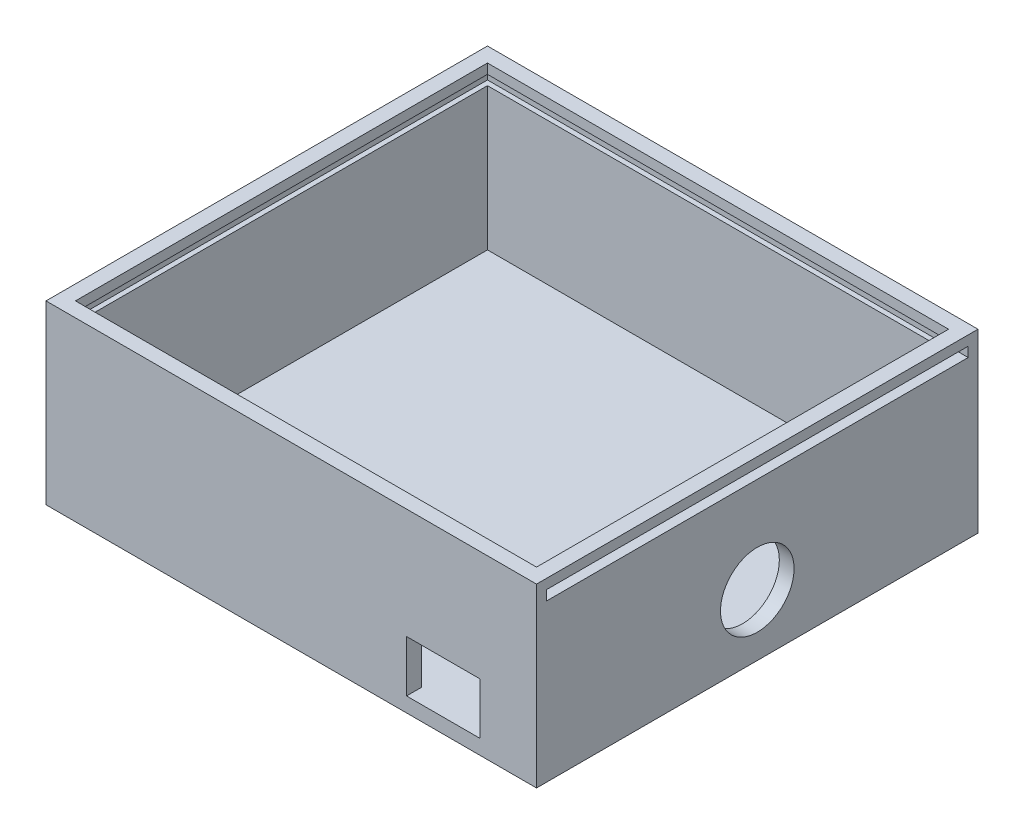
ISO-10303-21;
HEADER;
FILE_DESCRIPTION(('STEP AP214'),'2;1');
FILE_NAME('part.step','',(''),(''),'','','');
FILE_SCHEMA(('AUTOMOTIVE_DESIGN { 1 0 10303 214 1 1 1 1 }'));
ENDSEC;
DATA;
#1=APPLICATION_CONTEXT('core data for automotive mechanical design processes');
#2=APPLICATION_PROTOCOL_DEFINITION('international standard','automotive_design',2000,#1);
#3=PRODUCT_CONTEXT('',#1,'mechanical');
#4=PRODUCT('Part','Part','',(#3));
#5=PRODUCT_RELATED_PRODUCT_CATEGORY('part','',(#4));
#6=PRODUCT_DEFINITION_FORMATION('','',#4);
#7=PRODUCT_DEFINITION_CONTEXT('part definition',#1,'design');
#8=PRODUCT_DEFINITION('design','',#6,#7);
#9=PRODUCT_DEFINITION_SHAPE('','',#8);
#10=(LENGTH_UNIT() NAMED_UNIT(*) SI_UNIT(.MILLI.,.METRE.));
#11=(NAMED_UNIT(*) PLANE_ANGLE_UNIT() SI_UNIT($,.RADIAN.));
#12=(NAMED_UNIT(*) SI_UNIT($,.STERADIAN.) SOLID_ANGLE_UNIT());
#13=UNCERTAINTY_MEASURE_WITH_UNIT(LENGTH_MEASURE(1.E-05),#10,'distance_accuracy_value','');
#14=(GEOMETRIC_REPRESENTATION_CONTEXT(3) GLOBAL_UNCERTAINTY_ASSIGNED_CONTEXT((#13)) GLOBAL_UNIT_ASSIGNED_CONTEXT((#10,
#11,#12)) REPRESENTATION_CONTEXT('',''));
#15=CARTESIAN_POINT('',(0.,0.,0.));
#16=DIRECTION('',(0.,0.,1.));
#17=DIRECTION('',(1.,0.,0.));
#18=AXIS2_PLACEMENT_3D('',#15,#16,#17);
#19=CARTESIAN_POINT('',(3.,0.,90.));
#20=DIRECTION('',(1.,0.,0.));
#21=DIRECTION('',(0.,1.,0.));
#22=AXIS2_PLACEMENT_3D('',#19,#20,#21);
#23=PLANE('',#22);
#24=DIRECTION('',(0.,0.,1.));
#25=VECTOR('',#24,1.);
#26=CARTESIAN_POINT('',(3.,-2.00000000000002,90.));
#27=LINE('',#26,#25);
#28=CARTESIAN_POINT('',(3.,-2.00000000000002,3.));
#29=VERTEX_POINT('',#28);
#30=CARTESIAN_POINT('',(3.,-2.00000000000002,87.));
#31=VERTEX_POINT('',#30);
#32=EDGE_CURVE('E248',#29,#31,#27,.T.);
#33=ORIENTED_EDGE('',*,*,#32,.F.);
#34=DIRECTION('',(0.,-1.,0.));
#35=VECTOR('',#34,1.);
#36=CARTESIAN_POINT('',(3.,0.,3.));
#37=LINE('',#36,#35);
#38=CARTESIAN_POINT('',(3.,0.,3.));
#39=VERTEX_POINT('',#38);
#40=EDGE_CURVE('E284',#39,#29,#37,.T.);
#41=ORIENTED_EDGE('',*,*,#40,.F.);
#42=DIRECTION('',(0.,0.,-1.));
#43=VECTOR('',#42,1.);
#44=CARTESIAN_POINT('',(3.,0.,90.));
#45=LINE('',#44,#43);
#46=CARTESIAN_POINT('',(3.,0.,87.));
#47=VERTEX_POINT('',#46);
#48=EDGE_CURVE('E323',#47,#39,#45,.T.);
#49=ORIENTED_EDGE('',*,*,#48,.F.);
#50=DIRECTION('',(0.,-1.,0.));
#51=VECTOR('',#50,1.);
#52=CARTESIAN_POINT('',(3.,0.,87.));
#53=LINE('',#52,#51);
#54=EDGE_CURVE('E295',#47,#31,#53,.T.);
#55=ORIENTED_EDGE('',*,*,#54,.T.);
#56=EDGE_LOOP('',(#33,#41,#49,#55));
#57=FACE_BOUND('',#56,.T.);
#58=ADVANCED_FACE('F45',(#57),#23,.T.);
#59=CARTESIAN_POINT('',(97.,0.,90.));
#60=DIRECTION('',(-1.,0.,0.));
#61=DIRECTION('',(0.,0.,1.));
#62=AXIS2_PLACEMENT_3D('',#59,#60,#61);
#63=PLANE('',#62);
#64=DIRECTION('',(0.,0.,-1.));
#65=VECTOR('',#64,1.);
#66=CARTESIAN_POINT('',(97.,-2.00000000000002,90.));
#67=LINE('',#66,#65);
#68=CARTESIAN_POINT('',(97.,-2.00000000000002,87.));
#69=VERTEX_POINT('',#68);
#70=CARTESIAN_POINT('',(97.,-2.00000000000002,3.));
#71=VERTEX_POINT('',#70);
#72=EDGE_CURVE('E69',#69,#71,#67,.T.);
#73=ORIENTED_EDGE('',*,*,#72,.F.);
#74=DIRECTION('',(0.,1.,0.));
#75=VECTOR('',#74,1.);
#76=CARTESIAN_POINT('',(97.,0.,87.));
#77=LINE('',#76,#75);
#78=CARTESIAN_POINT('',(97.,0.,87.));
#79=VERTEX_POINT('',#78);
#80=EDGE_CURVE('E312',#69,#79,#77,.T.);
#81=ORIENTED_EDGE('',*,*,#80,.T.);
#82=DIRECTION('',(0.,0.,-1.));
#83=VECTOR('',#82,1.);
#84=CARTESIAN_POINT('',(97.,0.,90.));
#85=LINE('',#84,#83);
#86=CARTESIAN_POINT('',(97.,0.,3.));
#87=VERTEX_POINT('',#86);
#88=EDGE_CURVE('E307',#79,#87,#85,.T.);
#89=ORIENTED_EDGE('',*,*,#88,.T.);
#90=DIRECTION('',(0.,1.,0.));
#91=VECTOR('',#90,1.);
#92=CARTESIAN_POINT('',(97.,0.,3.));
#93=LINE('',#92,#91);
#94=EDGE_CURVE('E303',#71,#87,#93,.T.);
#95=ORIENTED_EDGE('',*,*,#94,.F.);
#96=EDGE_LOOP('',(#73,#81,#89,#95));
#97=FACE_BOUND('',#96,.T.);
#98=ADVANCED_FACE('F420',(#97),#63,.T.);
#99=CARTESIAN_POINT('',(0.,0.,87.));
#100=DIRECTION('',(0.,0.,1.));
#101=DIRECTION('',(1.,0.,0.));
#102=AXIS2_PLACEMENT_3D('',#99,#100,#101);
#103=PLANE('',#102);
#104=ORIENTED_EDGE('',*,*,#80,.F.);
#105=DIRECTION('',(-1.,0.,0.));
#106=VECTOR('',#105,1.);
#107=CARTESIAN_POINT('',(0.,-2.00000000000002,87.));
#108=LINE('',#107,#106);
#109=EDGE_CURVE('E251',#69,#31,#108,.T.);
#110=ORIENTED_EDGE('',*,*,#109,.T.);
#111=ORIENTED_EDGE('',*,*,#54,.F.);
#112=DIRECTION('',(-1.,0.,0.));
#113=VECTOR('',#112,1.);
#114=CARTESIAN_POINT('',(0.,0.,87.));
#115=LINE('',#114,#113);
#116=EDGE_CURVE('E322',#79,#47,#115,.T.);
#117=ORIENTED_EDGE('',*,*,#116,.F.);
#118=EDGE_LOOP('',(#104,#110,#111,#117));
#119=FACE_BOUND('',#118,.T.);
#120=ADVANCED_FACE('F426',(#119),#103,.F.);
#121=CARTESIAN_POINT('',(0.,0.,3.));
#122=DIRECTION('',(0.,0.,1.));
#123=DIRECTION('',(1.,0.,0.));
#124=AXIS2_PLACEMENT_3D('',#121,#122,#123);
#125=PLANE('',#124);
#126=DIRECTION('',(-1.,0.,0.));
#127=VECTOR('',#126,1.);
#128=CARTESIAN_POINT('',(0.,-2.00000000000002,3.));
#129=LINE('',#128,#127);
#130=EDGE_CURVE('E11',#71,#29,#129,.T.);
#131=ORIENTED_EDGE('',*,*,#130,.F.);
#132=ORIENTED_EDGE('',*,*,#94,.T.);
#133=DIRECTION('',(-1.,0.,0.));
#134=VECTOR('',#133,1.);
#135=CARTESIAN_POINT('',(0.,0.,3.));
#136=LINE('',#135,#134);
#137=EDGE_CURVE('E317',#87,#39,#136,.T.);
#138=ORIENTED_EDGE('',*,*,#137,.T.);
#139=ORIENTED_EDGE('',*,*,#40,.T.);
#140=EDGE_LOOP('',(#131,#132,#138,#139));
#141=FACE_BOUND('',#140,.T.);
#142=ADVANCED_FACE('F431',(#141),#125,.T.);
#143=CARTESIAN_POINT('',(0.,0.,90.));
#144=DIRECTION('',(0.,-1.,0.));
#145=DIRECTION('',(0.,0.,-1.));
#146=AXIS2_PLACEMENT_3D('',#143,#144,#145);
#147=PLANE('',#146);
#148=DIRECTION('',(-1.,0.,0.));
#149=VECTOR('',#148,1.);
#150=CARTESIAN_POINT('',(0.,0.,0.));
#151=LINE('',#150,#149);
#152=CARTESIAN_POINT('',(100.,0.,0.));
#153=VERTEX_POINT('',#152);
#154=CARTESIAN_POINT('',(0.,0.,0.));
#155=VERTEX_POINT('',#154);
#156=EDGE_CURVE('E340',#153,#155,#151,.T.);
#157=ORIENTED_EDGE('',*,*,#156,.T.);
#158=DIRECTION('',(0.,0.,-1.));
#159=VECTOR('',#158,1.);
#160=CARTESIAN_POINT('',(0.,0.,90.));
#161=LINE('',#160,#159);
#162=CARTESIAN_POINT('',(0.,0.,90.));
#163=VERTEX_POINT('',#162);
#164=EDGE_CURVE('E349',#163,#155,#161,.T.);
#165=ORIENTED_EDGE('',*,*,#164,.F.);
#166=DIRECTION('',(-1.,0.,0.));
#167=VECTOR('',#166,1.);
#168=CARTESIAN_POINT('',(0.,0.,90.));
#169=LINE('',#168,#167);
#170=CARTESIAN_POINT('',(100.,0.,90.));
#171=VERTEX_POINT('',#170);
#172=EDGE_CURVE('E346',#171,#163,#169,.T.);
#173=ORIENTED_EDGE('',*,*,#172,.F.);
#174=DIRECTION('',(0.,0.,-1.));
#175=VECTOR('',#174,1.);
#176=CARTESIAN_POINT('',(100.,0.,90.));
#177=LINE('',#176,#175);
#178=EDGE_CURVE('E364',#171,#153,#177,.T.);
#179=ORIENTED_EDGE('',*,*,#178,.T.);
#180=EDGE_LOOP('',(#157,#165,#173,#179));
#181=FACE_BOUND('',#180,.T.);
#182=ORIENTED_EDGE('',*,*,#137,.F.);
#183=ORIENTED_EDGE('',*,*,#88,.F.);
#184=ORIENTED_EDGE('',*,*,#116,.T.);
#185=ORIENTED_EDGE('',*,*,#48,.T.);
#186=EDGE_LOOP('',(#182,#183,#184,#185));
#187=FACE_BOUND('',#186,.T.);
#188=ADVANCED_FACE('F428',(#181,#187),#147,.F.);
#189=CARTESIAN_POINT('',(0.,0.,90.));
#190=DIRECTION('',(1.,0.,0.));
#191=DIRECTION('',(0.,1.,0.));
#192=AXIS2_PLACEMENT_3D('',#189,#190,#191);
#193=PLANE('',#192);
#194=DIRECTION('',(0.,-1.,0.));
#195=VECTOR('',#194,1.);
#196=CARTESIAN_POINT('',(0.,0.,0.));
#197=LINE('',#196,#195);
#198=CARTESIAN_POINT('',(0.,-36.,0.));
#199=VERTEX_POINT('',#198);
#200=EDGE_CURVE('E293',#155,#199,#197,.T.);
#201=ORIENTED_EDGE('',*,*,#200,.T.);
#202=DIRECTION('',(0.,0.,-1.));
#203=VECTOR('',#202,1.);
#204=CARTESIAN_POINT('',(0.,-36.,90.));
#205=LINE('',#204,#203);
#206=CARTESIAN_POINT('',(0.,-36.,90.));
#207=VERTEX_POINT('',#206);
#208=EDGE_CURVE('E372',#207,#199,#205,.T.);
#209=ORIENTED_EDGE('',*,*,#208,.F.);
#210=DIRECTION('',(0.,-1.,0.));
#211=VECTOR('',#210,1.);
#212=CARTESIAN_POINT('',(0.,0.,90.));
#213=LINE('',#212,#211);
#214=EDGE_CURVE('E335',#163,#207,#213,.T.);
#215=ORIENTED_EDGE('',*,*,#214,.F.);
#216=ORIENTED_EDGE('',*,*,#164,.T.);
#217=EDGE_LOOP('',(#201,#209,#215,#216));
#218=FACE_BOUND('',#217,.T.);
#219=ADVANCED_FACE('F47',(#218),#193,.F.);
#220=CARTESIAN_POINT('',(0.,-36.,90.));
#221=DIRECTION('',(0.,1.,0.));
#222=DIRECTION('',(0.,0.,1.));
#223=AXIS2_PLACEMENT_3D('',#220,#221,#222);
#224=PLANE('',#223);
#225=DIRECTION('',(1.,0.,0.));
#226=VECTOR('',#225,1.);
#227=CARTESIAN_POINT('',(0.,-36.,0.));
#228=LINE('',#227,#226);
#229=CARTESIAN_POINT('',(100.,-36.,0.));
#230=VERTEX_POINT('',#229);
#231=EDGE_CURVE('E353',#199,#230,#228,.T.);
#232=ORIENTED_EDGE('',*,*,#231,.T.);
#233=DIRECTION('',(0.,0.,-1.));
#234=VECTOR('',#233,1.);
#235=CARTESIAN_POINT('',(100.,-36.,90.));
#236=LINE('',#235,#234);
#237=CARTESIAN_POINT('',(100.,-36.,90.));
#238=VERTEX_POINT('',#237);
#239=EDGE_CURVE('E368',#238,#230,#236,.T.);
#240=ORIENTED_EDGE('',*,*,#239,.F.);
#241=DIRECTION('',(1.,0.,0.));
#242=VECTOR('',#241,1.);
#243=CARTESIAN_POINT('',(0.,-36.,90.));
#244=LINE('',#243,#242);
#245=EDGE_CURVE('E339',#207,#238,#244,.T.);
#246=ORIENTED_EDGE('',*,*,#245,.F.);
#247=ORIENTED_EDGE('',*,*,#208,.T.);
#248=EDGE_LOOP('',(#232,#240,#246,#247));
#249=FACE_BOUND('',#248,.T.);
#250=ADVANCED_FACE('F483',(#249),#224,.F.);
#251=CARTESIAN_POINT('',(100.,0.,90.));
#252=DIRECTION('',(-1.,0.,0.));
#253=DIRECTION('',(0.,0.,1.));
#254=AXIS2_PLACEMENT_3D('',#251,#252,#253);
#255=PLANE('',#254);
#256=CARTESIAN_POINT('',(100.,-23.5,45.));
#257=DIRECTION('',(1.,0.,0.));
#258=DIRECTION('',(0.,0.,-1.));
#259=AXIS2_PLACEMENT_3D('',#256,#257,#258);
#260=CIRCLE('',#259,7.5);
#261=CARTESIAN_POINT('',(100.,-23.5,37.5));
#262=VERTEX_POINT('',#261);
#263=EDGE_CURVE('E214',#262,#262,#260,.T.);
#264=ORIENTED_EDGE('',*,*,#263,.F.);
#265=EDGE_LOOP('',(#264));
#266=FACE_BOUND('',#265,.T.);
#267=DIRECTION('',(0.,0.,-1.));
#268=VECTOR('',#267,1.);
#269=CARTESIAN_POINT('',(100.,-4.00000000000002,88.));
#270=LINE('',#269,#268);
#271=CARTESIAN_POINT('',(100.,-4.00000000000002,88.));
#272=VERTEX_POINT('',#271);
#273=CARTESIAN_POINT('',(100.,-4.,2.));
#274=VERTEX_POINT('',#273);
#275=EDGE_CURVE('E222',#272,#274,#270,.T.);
#276=ORIENTED_EDGE('',*,*,#275,.F.);
#277=DIRECTION('',(0.,-1.,0.));
#278=VECTOR('',#277,1.);
#279=CARTESIAN_POINT('',(100.,-2.00000000000002,88.));
#280=LINE('',#279,#278);
#281=CARTESIAN_POINT('',(100.,-2.00000000000002,88.));
#282=VERTEX_POINT('',#281);
#283=EDGE_CURVE('E62',#282,#272,#280,.T.);
#284=ORIENTED_EDGE('',*,*,#283,.F.);
#285=DIRECTION('',(0.,0.,1.));
#286=VECTOR('',#285,1.);
#287=CARTESIAN_POINT('',(100.,-2.00000000000002,88.));
#288=LINE('',#287,#286);
#289=CARTESIAN_POINT('',(100.,-2.00000000000002,2.));
#290=VERTEX_POINT('',#289);
#291=EDGE_CURVE('E207',#290,#282,#288,.T.);
#292=ORIENTED_EDGE('',*,*,#291,.F.);
#293=DIRECTION('',(0.,1.,0.));
#294=VECTOR('',#293,1.);
#295=CARTESIAN_POINT('',(100.,-2.00000000000002,2.));
#296=LINE('',#295,#294);
#297=EDGE_CURVE('E211',#274,#290,#296,.T.);
#298=ORIENTED_EDGE('',*,*,#297,.F.);
#299=EDGE_LOOP('',(#276,#284,#292,#298));
#300=FACE_BOUND('',#299,.T.);
#301=DIRECTION('',(0.,1.,0.));
#302=VECTOR('',#301,1.);
#303=CARTESIAN_POINT('',(100.,0.,0.));
#304=LINE('',#303,#302);
#305=EDGE_CURVE('E356',#230,#153,#304,.T.);
#306=ORIENTED_EDGE('',*,*,#305,.T.);
#307=ORIENTED_EDGE('',*,*,#178,.F.);
#308=DIRECTION('',(0.,1.,0.));
#309=VECTOR('',#308,1.);
#310=CARTESIAN_POINT('',(100.,0.,90.));
#311=LINE('',#310,#309);
#312=EDGE_CURVE('E343',#238,#171,#311,.T.);
#313=ORIENTED_EDGE('',*,*,#312,.F.);
#314=ORIENTED_EDGE('',*,*,#239,.T.);
#315=EDGE_LOOP('',(#306,#307,#313,#314));
#316=FACE_BOUND('',#315,.T.);
#317=ADVANCED_FACE('F474',(#266,#300,#316),#255,.F.);
#318=CARTESIAN_POINT('',(0.,0.,90.));
#319=DIRECTION('',(0.,0.,1.));
#320=DIRECTION('',(1.,0.,0.));
#321=AXIS2_PLACEMENT_3D('',#318,#319,#320);
#322=PLANE('',#321);
#323=DIRECTION('',(0.,1.,0.));
#324=VECTOR('',#323,1.);
#325=CARTESIAN_POINT('',(88.5,-33.,90.));
#326=LINE('',#325,#324);
#327=CARTESIAN_POINT('',(88.5,-33.,90.));
#328=VERTEX_POINT('',#327);
#329=CARTESIAN_POINT('',(88.5,-22.5,90.));
#330=VERTEX_POINT('',#329);
#331=EDGE_CURVE('E255',#328,#330,#326,.T.);
#332=ORIENTED_EDGE('',*,*,#331,.F.);
#333=DIRECTION('',(1.,0.,0.));
#334=VECTOR('',#333,1.);
#335=CARTESIAN_POINT('',(88.5,-33.,90.));
#336=LINE('',#335,#334);
#337=CARTESIAN_POINT('',(73.5,-33.,90.));
#338=VERTEX_POINT('',#337);
#339=EDGE_CURVE('E266',#338,#328,#336,.T.);
#340=ORIENTED_EDGE('',*,*,#339,.F.);
#341=DIRECTION('',(0.,-1.,0.));
#342=VECTOR('',#341,1.);
#343=CARTESIAN_POINT('',(73.5,-33.,90.));
#344=LINE('',#343,#342);
#345=CARTESIAN_POINT('',(73.5,-22.5,90.));
#346=VERTEX_POINT('',#345);
#347=EDGE_CURVE('E262',#346,#338,#344,.T.);
#348=ORIENTED_EDGE('',*,*,#347,.F.);
#349=DIRECTION('',(-1.,0.,0.));
#350=VECTOR('',#349,1.);
#351=CARTESIAN_POINT('',(88.5,-22.5,90.));
#352=LINE('',#351,#350);
#353=EDGE_CURVE('E258',#330,#346,#352,.T.);
#354=ORIENTED_EDGE('',*,*,#353,.F.);
#355=EDGE_LOOP('',(#332,#340,#348,#354));
#356=FACE_BOUND('',#355,.T.);
#357=ORIENTED_EDGE('',*,*,#214,.T.);
#358=ORIENTED_EDGE('',*,*,#245,.T.);
#359=ORIENTED_EDGE('',*,*,#312,.T.);
#360=ORIENTED_EDGE('',*,*,#172,.T.);
#361=EDGE_LOOP('',(#357,#358,#359,#360));
#362=FACE_BOUND('',#361,.T.);
#363=ADVANCED_FACE('F466',(#356,#362),#322,.T.);
#364=CARTESIAN_POINT('',(0.,0.,0.));
#365=DIRECTION('',(0.,0.,1.));
#366=DIRECTION('',(1.,0.,0.));
#367=AXIS2_PLACEMENT_3D('',#364,#365,#366);
#368=PLANE('',#367);
#369=ORIENTED_EDGE('',*,*,#200,.F.);
#370=ORIENTED_EDGE('',*,*,#156,.F.);
#371=ORIENTED_EDGE('',*,*,#305,.F.);
#372=ORIENTED_EDGE('',*,*,#231,.F.);
#373=EDGE_LOOP('',(#369,#370,#371,#372));
#374=FACE_BOUND('',#373,.T.);
#375=ADVANCED_FACE('F459',(#374),#368,.F.);
#376=DIRECTION('',(0.,0.,-1.));
#377=VECTOR('',#376,1.);
#378=CARTESIAN_POINT('',(3.,-4.00000000000002,90.));
#379=LINE('',#378,#377);
#380=CARTESIAN_POINT('',(3.,-4.00000000000002,87.));
#381=VERTEX_POINT('',#380);
#382=CARTESIAN_POINT('',(3.,-4.,3.));
#383=VERTEX_POINT('',#382);
#384=EDGE_CURVE('E239',#381,#383,#379,.T.);
#385=ORIENTED_EDGE('',*,*,#384,.F.);
#386=CARTESIAN_POINT('',(3.,-33.,87.));
#387=VERTEX_POINT('',#386);
#388=EDGE_CURVE('E300',#381,#387,#53,.T.);
#389=ORIENTED_EDGE('',*,*,#388,.T.);
#390=DIRECTION('',(0.,0.,-1.));
#391=VECTOR('',#390,1.);
#392=CARTESIAN_POINT('',(3.,-33.,90.));
#393=LINE('',#392,#391);
#394=CARTESIAN_POINT('',(3.,-33.,3.));
#395=VERTEX_POINT('',#394);
#396=EDGE_CURVE('E289',#387,#395,#393,.T.);
#397=ORIENTED_EDGE('',*,*,#396,.T.);
#398=EDGE_CURVE('E274',#383,#395,#37,.T.);
#399=ORIENTED_EDGE('',*,*,#398,.F.);
#400=EDGE_LOOP('',(#385,#389,#397,#399));
#401=FACE_BOUND('',#400,.T.);
#402=ADVANCED_FACE('F411',(#401),#23,.T.);
#403=CARTESIAN_POINT('',(0.,-33.,90.));
#404=DIRECTION('',(0.,1.,0.));
#405=DIRECTION('',(0.,0.,1.));
#406=AXIS2_PLACEMENT_3D('',#403,#404,#405);
#407=PLANE('',#406);
#408=DIRECTION('',(1.,0.,0.));
#409=VECTOR('',#408,1.);
#410=CARTESIAN_POINT('',(0.,-33.,87.));
#411=LINE('',#410,#409);
#412=CARTESIAN_POINT('',(73.5,-33.,87.));
#413=VERTEX_POINT('',#412);
#414=EDGE_CURVE('E308',#387,#413,#411,.T.);
#415=ORIENTED_EDGE('',*,*,#414,.T.);
#416=DIRECTION('',(0.,0.,1.));
#417=VECTOR('',#416,1.);
#418=CARTESIAN_POINT('',(73.5,-33.,80.));
#419=LINE('',#418,#417);
#420=EDGE_CURVE('E275',#413,#338,#419,.T.);
#421=ORIENTED_EDGE('',*,*,#420,.T.);
#422=ORIENTED_EDGE('',*,*,#339,.T.);
#423=DIRECTION('',(0.,0.,1.));
#424=VECTOR('',#423,1.);
#425=CARTESIAN_POINT('',(88.5,-33.,80.));
#426=LINE('',#425,#424);
#427=CARTESIAN_POINT('',(88.5,-33.,87.));
#428=VERTEX_POINT('',#427);
#429=EDGE_CURVE('E271',#428,#328,#426,.T.);
#430=ORIENTED_EDGE('',*,*,#429,.F.);
#431=CARTESIAN_POINT('',(97.,-33.,87.));
#432=VERTEX_POINT('',#431);
#433=EDGE_CURVE('E299',#428,#432,#411,.T.);
#434=ORIENTED_EDGE('',*,*,#433,.T.);
#435=DIRECTION('',(0.,0.,-1.));
#436=VECTOR('',#435,1.);
#437=CARTESIAN_POINT('',(97.,-33.,90.));
#438=LINE('',#437,#436);
#439=CARTESIAN_POINT('',(97.,-33.,3.));
#440=VERTEX_POINT('',#439);
#441=EDGE_CURVE('E294',#432,#440,#438,.T.);
#442=ORIENTED_EDGE('',*,*,#441,.T.);
#443=DIRECTION('',(1.,0.,0.));
#444=VECTOR('',#443,1.);
#445=CARTESIAN_POINT('',(0.,-33.,3.));
#446=LINE('',#445,#444);
#447=EDGE_CURVE('E288',#395,#440,#446,.T.);
#448=ORIENTED_EDGE('',*,*,#447,.F.);
#449=ORIENTED_EDGE('',*,*,#396,.F.);
#450=EDGE_LOOP('',(#415,#421,#422,#430,#434,#442,#448,#449));
#451=FACE_BOUND('',#450,.T.);
#452=ADVANCED_FACE('F403',(#451),#407,.T.);
#453=CARTESIAN_POINT('',(97.,-23.5,45.));
#454=DIRECTION('',(-1.,0.,0.));
#455=DIRECTION('',(0.,0.,1.));
#456=AXIS2_PLACEMENT_3D('',#453,#454,#455);
#457=CIRCLE('',#456,7.5);
#458=CARTESIAN_POINT('',(97.,-23.5,52.5));
#459=VERTEX_POINT('',#458);
#460=EDGE_CURVE('E49',#459,#459,#457,.T.);
#461=ORIENTED_EDGE('',*,*,#460,.F.);
#462=EDGE_LOOP('',(#461));
#463=FACE_BOUND('',#462,.T.);
#464=DIRECTION('',(0.,0.,1.));
#465=VECTOR('',#464,1.);
#466=CARTESIAN_POINT('',(97.,-4.00000000000002,90.));
#467=LINE('',#466,#465);
#468=CARTESIAN_POINT('',(97.,-4.,3.));
#469=VERTEX_POINT('',#468);
#470=CARTESIAN_POINT('',(97.,-4.00000000000002,87.));
#471=VERTEX_POINT('',#470);
#472=EDGE_CURVE('E231',#469,#471,#467,.T.);
#473=ORIENTED_EDGE('',*,*,#472,.F.);
#474=EDGE_CURVE('E313',#440,#469,#93,.T.);
#475=ORIENTED_EDGE('',*,*,#474,.F.);
#476=ORIENTED_EDGE('',*,*,#441,.F.);
#477=EDGE_CURVE('E318',#432,#471,#77,.T.);
#478=ORIENTED_EDGE('',*,*,#477,.T.);
#479=EDGE_LOOP('',(#473,#475,#476,#478));
#480=FACE_BOUND('',#479,.T.);
#481=ADVANCED_FACE('F396',(#463,#480),#63,.T.);
#482=ORIENTED_EDGE('',*,*,#388,.F.);
#483=DIRECTION('',(1.,0.,0.));
#484=VECTOR('',#483,1.);
#485=CARTESIAN_POINT('',(0.,-4.00000000000002,87.));
#486=LINE('',#485,#484);
#487=EDGE_CURVE('E242',#381,#471,#486,.T.);
#488=ORIENTED_EDGE('',*,*,#487,.T.);
#489=ORIENTED_EDGE('',*,*,#477,.F.);
#490=ORIENTED_EDGE('',*,*,#433,.F.);
#491=DIRECTION('',(0.,1.,0.));
#492=VECTOR('',#491,1.);
#493=CARTESIAN_POINT('',(88.5,0.,87.));
#494=LINE('',#493,#492);
#495=CARTESIAN_POINT('',(88.5,-22.5,87.));
#496=VERTEX_POINT('',#495);
#497=EDGE_CURVE('E384',#428,#496,#494,.T.);
#498=ORIENTED_EDGE('',*,*,#497,.T.);
#499=DIRECTION('',(-1.,0.,0.));
#500=VECTOR('',#499,1.);
#501=CARTESIAN_POINT('',(0.,-22.5,87.));
#502=LINE('',#501,#500);
#503=CARTESIAN_POINT('',(73.5,-22.5,87.));
#504=VERTEX_POINT('',#503);
#505=EDGE_CURVE('E376',#496,#504,#502,.T.);
#506=ORIENTED_EDGE('',*,*,#505,.T.);
#507=DIRECTION('',(0.,-1.,0.));
#508=VECTOR('',#507,1.);
#509=CARTESIAN_POINT('',(73.5,0.,87.));
#510=LINE('',#509,#508);
#511=EDGE_CURVE('E380',#504,#413,#510,.T.);
#512=ORIENTED_EDGE('',*,*,#511,.T.);
#513=ORIENTED_EDGE('',*,*,#414,.F.);
#514=EDGE_LOOP('',(#482,#488,#489,#490,#498,#506,#512,#513));
#515=FACE_BOUND('',#514,.T.);
#516=ADVANCED_FACE('F408',(#515),#103,.F.);
#517=DIRECTION('',(1.,0.,0.));
#518=VECTOR('',#517,1.);
#519=CARTESIAN_POINT('',(0.,-4.,3.));
#520=LINE('',#519,#518);
#521=EDGE_CURVE('E55',#383,#469,#520,.T.);
#522=ORIENTED_EDGE('',*,*,#521,.F.);
#523=ORIENTED_EDGE('',*,*,#398,.T.);
#524=ORIENTED_EDGE('',*,*,#447,.T.);
#525=ORIENTED_EDGE('',*,*,#474,.T.);
#526=EDGE_LOOP('',(#522,#523,#524,#525));
#527=FACE_BOUND('',#526,.T.);
#528=ADVANCED_FACE('F399',(#527),#125,.T.);
#529=CARTESIAN_POINT('',(88.5,-33.,80.));
#530=DIRECTION('',(1.,0.,0.));
#531=DIRECTION('',(0.,0.,-1.));
#532=AXIS2_PLACEMENT_3D('',#529,#530,#531);
#533=PLANE('',#532);
#534=ORIENTED_EDGE('',*,*,#429,.T.);
#535=ORIENTED_EDGE('',*,*,#331,.T.);
#536=DIRECTION('',(0.,0.,1.));
#537=VECTOR('',#536,1.);
#538=CARTESIAN_POINT('',(88.5,-22.5,80.));
#539=LINE('',#538,#537);
#540=EDGE_CURVE('E270',#496,#330,#539,.T.);
#541=ORIENTED_EDGE('',*,*,#540,.F.);
#542=ORIENTED_EDGE('',*,*,#497,.F.);
#543=EDGE_LOOP('',(#534,#535,#541,#542));
#544=FACE_BOUND('',#543,.T.);
#545=ADVANCED_FACE('F566',(#544),#533,.F.);
#546=CARTESIAN_POINT('',(73.5,-33.,80.));
#547=DIRECTION('',(-1.,0.,0.));
#548=DIRECTION('',(0.,0.,1.));
#549=AXIS2_PLACEMENT_3D('',#546,#547,#548);
#550=PLANE('',#549);
#551=DIRECTION('',(0.,0.,1.));
#552=VECTOR('',#551,1.);
#553=CARTESIAN_POINT('',(73.5,-22.5,80.));
#554=LINE('',#553,#552);
#555=EDGE_CURVE('E278',#504,#346,#554,.T.);
#556=ORIENTED_EDGE('',*,*,#555,.T.);
#557=ORIENTED_EDGE('',*,*,#347,.T.);
#558=ORIENTED_EDGE('',*,*,#420,.F.);
#559=ORIENTED_EDGE('',*,*,#511,.F.);
#560=EDGE_LOOP('',(#556,#557,#558,#559));
#561=FACE_BOUND('',#560,.T.);
#562=ADVANCED_FACE('F445',(#561),#550,.F.);
#563=CARTESIAN_POINT('',(88.5,-22.5,80.));
#564=DIRECTION('',(0.,1.,0.));
#565=DIRECTION('',(-1.,0.,0.));
#566=AXIS2_PLACEMENT_3D('',#563,#564,#565);
#567=PLANE('',#566);
#568=ORIENTED_EDGE('',*,*,#540,.T.);
#569=ORIENTED_EDGE('',*,*,#353,.T.);
#570=ORIENTED_EDGE('',*,*,#555,.F.);
#571=ORIENTED_EDGE('',*,*,#505,.F.);
#572=EDGE_LOOP('',(#568,#569,#570,#571));
#573=FACE_BOUND('',#572,.T.);
#574=ADVANCED_FACE('F436',(#573),#567,.F.);
#575=CARTESIAN_POINT('',(1.99999999999997,-2.00000000000002,88.));
#576=DIRECTION('',(0.,1.,0.));
#577=DIRECTION('',(0.,0.,1.));
#578=AXIS2_PLACEMENT_3D('',#575,#576,#577);
#579=PLANE('',#578);
#580=ORIENTED_EDGE('',*,*,#291,.T.);
#581=DIRECTION('',(1.,0.,0.));
#582=VECTOR('',#581,1.);
#583=CARTESIAN_POINT('',(1.99999999999997,-2.00000000000002,88.));
#584=LINE('',#583,#582);
#585=CARTESIAN_POINT('',(1.99999999999997,-2.00000000000002,88.));
#586=VERTEX_POINT('',#585);
#587=EDGE_CURVE('E228',#586,#282,#584,.T.);
#588=ORIENTED_EDGE('',*,*,#587,.F.);
#589=DIRECTION('',(0.,0.,1.));
#590=VECTOR('',#589,1.);
#591=CARTESIAN_POINT('',(1.99999999999997,-2.00000000000002,88.));
#592=LINE('',#591,#590);
#593=CARTESIAN_POINT('',(1.99999999999997,-2.00000000000002,2.));
#594=VERTEX_POINT('',#593);
#595=EDGE_CURVE('E192',#594,#586,#592,.T.);
#596=ORIENTED_EDGE('',*,*,#595,.F.);
#597=DIRECTION('',(1.,0.,0.));
#598=VECTOR('',#597,1.);
#599=CARTESIAN_POINT('',(1.99999999999997,-2.00000000000002,2.));
#600=LINE('',#599,#598);
#601=EDGE_CURVE('E232',#594,#290,#600,.T.);
#602=ORIENTED_EDGE('',*,*,#601,.T.);
#603=EDGE_LOOP('',(#580,#588,#596,#602));
#604=FACE_BOUND('',#603,.T.);
#605=ORIENTED_EDGE('',*,*,#72,.T.);
#606=ORIENTED_EDGE('',*,*,#130,.T.);
#607=ORIENTED_EDGE('',*,*,#32,.T.);
#608=ORIENTED_EDGE('',*,*,#109,.F.);
#609=EDGE_LOOP('',(#605,#606,#607,#608));
#610=FACE_BOUND('',#609,.T.);
#611=ADVANCED_FACE('F434',(#604,#610),#579,.F.);
#612=CARTESIAN_POINT('',(1.99999999999997,-4.00000000000002,88.));
#613=DIRECTION('',(0.,-1.,0.));
#614=DIRECTION('',(0.,0.,-1.));
#615=AXIS2_PLACEMENT_3D('',#612,#613,#614);
#616=PLANE('',#615);
#617=ORIENTED_EDGE('',*,*,#275,.T.);
#618=DIRECTION('',(1.,0.,0.));
#619=VECTOR('',#618,1.);
#620=CARTESIAN_POINT('',(1.99999999999997,-4.,2.));
#621=LINE('',#620,#619);
#622=CARTESIAN_POINT('',(1.99999999999997,-4.,2.));
#623=VERTEX_POINT('',#622);
#624=EDGE_CURVE('E191',#623,#274,#621,.T.);
#625=ORIENTED_EDGE('',*,*,#624,.F.);
#626=DIRECTION('',(0.,0.,-1.));
#627=VECTOR('',#626,1.);
#628=CARTESIAN_POINT('',(1.99999999999997,-4.00000000000002,88.));
#629=LINE('',#628,#627);
#630=CARTESIAN_POINT('',(1.99999999999997,-4.00000000000002,88.));
#631=VERTEX_POINT('',#630);
#632=EDGE_CURVE('E195',#631,#623,#629,.T.);
#633=ORIENTED_EDGE('',*,*,#632,.F.);
#634=DIRECTION('',(1.,0.,0.));
#635=VECTOR('',#634,1.);
#636=CARTESIAN_POINT('',(1.99999999999997,-4.00000000000002,88.));
#637=LINE('',#636,#635);
#638=EDGE_CURVE('E181',#631,#272,#637,.T.);
#639=ORIENTED_EDGE('',*,*,#638,.T.);
#640=EDGE_LOOP('',(#617,#625,#633,#639));
#641=FACE_BOUND('',#640,.T.);
#642=ORIENTED_EDGE('',*,*,#384,.T.);
#643=ORIENTED_EDGE('',*,*,#521,.T.);
#644=ORIENTED_EDGE('',*,*,#472,.T.);
#645=ORIENTED_EDGE('',*,*,#487,.F.);
#646=EDGE_LOOP('',(#642,#643,#644,#645));
#647=FACE_BOUND('',#646,.T.);
#648=ADVANCED_FACE('F196',(#641,#647),#616,.F.);
#649=CARTESIAN_POINT('',(1.99999999999997,-2.00000000000002,88.));
#650=DIRECTION('',(0.,0.,1.));
#651=DIRECTION('',(1.,0.,0.));
#652=AXIS2_PLACEMENT_3D('',#649,#650,#651);
#653=PLANE('',#652);
#654=ORIENTED_EDGE('',*,*,#283,.T.);
#655=ORIENTED_EDGE('',*,*,#638,.F.);
#656=DIRECTION('',(0.,-1.,0.));
#657=VECTOR('',#656,1.);
#658=CARTESIAN_POINT('',(1.99999999999997,-2.00000000000002,88.));
#659=LINE('',#658,#657);
#660=EDGE_CURVE('E185',#586,#631,#659,.T.);
#661=ORIENTED_EDGE('',*,*,#660,.F.);
#662=ORIENTED_EDGE('',*,*,#587,.T.);
#663=EDGE_LOOP('',(#654,#655,#661,#662));
#664=FACE_BOUND('',#663,.T.);
#665=ADVANCED_FACE('F183',(#664),#653,.F.);
#666=CARTESIAN_POINT('',(1.99999999999997,-2.00000000000002,2.));
#667=DIRECTION('',(0.,0.,-1.));
#668=DIRECTION('',(-1.,0.,0.));
#669=AXIS2_PLACEMENT_3D('',#666,#667,#668);
#670=PLANE('',#669);
#671=ORIENTED_EDGE('',*,*,#297,.T.);
#672=ORIENTED_EDGE('',*,*,#601,.F.);
#673=DIRECTION('',(0.,1.,0.));
#674=VECTOR('',#673,1.);
#675=CARTESIAN_POINT('',(1.99999999999997,-2.00000000000002,2.));
#676=LINE('',#675,#674);
#677=EDGE_CURVE('E202',#623,#594,#676,.T.);
#678=ORIENTED_EDGE('',*,*,#677,.F.);
#679=ORIENTED_EDGE('',*,*,#624,.T.);
#680=EDGE_LOOP('',(#671,#672,#678,#679));
#681=FACE_BOUND('',#680,.T.);
#682=ADVANCED_FACE('F625',(#681),#670,.F.);
#683=CARTESIAN_POINT('',(1.99999999999997,0.,0.));
#684=DIRECTION('',(1.,0.,0.));
#685=DIRECTION('',(0.,0.,-1.));
#686=AXIS2_PLACEMENT_3D('',#683,#684,#685);
#687=PLANE('',#686);
#688=ORIENTED_EDGE('',*,*,#660,.T.);
#689=ORIENTED_EDGE('',*,*,#632,.T.);
#690=ORIENTED_EDGE('',*,*,#677,.T.);
#691=ORIENTED_EDGE('',*,*,#595,.T.);
#692=EDGE_LOOP('',(#688,#689,#690,#691));
#693=FACE_BOUND('',#692,.T.);
#694=ADVANCED_FACE('F204',(#693),#687,.T.);
#695=CARTESIAN_POINT('',(90.,-23.5,45.));
#696=DIRECTION('',(1.,0.,0.));
#697=DIRECTION('',(0.,0.,-1.));
#698=AXIS2_PLACEMENT_3D('',#695,#696,#697);
#699=CYLINDRICAL_SURFACE('',#698,7.5);
#700=ORIENTED_EDGE('',*,*,#460,.T.);
#701=EDGE_LOOP('',(#700));
#702=FACE_BOUND('',#701,.T.);
#703=ORIENTED_EDGE('',*,*,#263,.T.);
#704=EDGE_LOOP('',(#703));
#705=FACE_BOUND('',#704,.T.);
#706=ADVANCED_FACE('F639',(#702,#705),#699,.F.);
#707=CLOSED_SHELL('',(#58,#98,#120,#142,#188,#219,#250,#317,#363,#375,#402,#452,#481,#516,#528,
#545,#562,#574,#611,#648,#665,#682,#694,#706));
#708=MANIFOLD_SOLID_BREP('B2',#707);
#709=ADVANCED_BREP_SHAPE_REPRESENTATION('',(#18,#708),#14);
#710=SHAPE_DEFINITION_REPRESENTATION(#9,#709);
ENDSEC;
END-ISO-10303-21;
